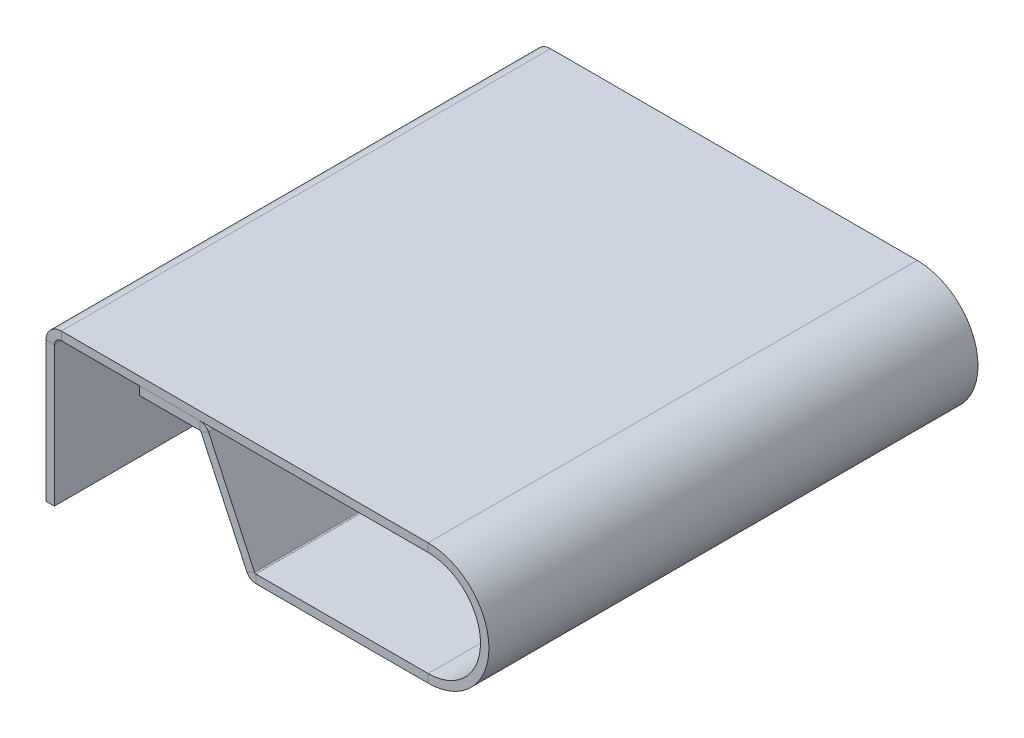
ISO-10303-21;
HEADER;
FILE_DESCRIPTION(('STEP AP214'),'2;1');
FILE_NAME('part.step','',(''),(''),'','','');
FILE_SCHEMA(('AUTOMOTIVE_DESIGN { 1 0 10303 214 1 1 1 1 }'));
ENDSEC;
DATA;
#1=APPLICATION_CONTEXT('core data for automotive mechanical design processes');
#2=APPLICATION_PROTOCOL_DEFINITION('international standard','automotive_design',2000,#1);
#3=PRODUCT_CONTEXT('',#1,'mechanical');
#4=PRODUCT('Part','Part','',(#3));
#5=PRODUCT_RELATED_PRODUCT_CATEGORY('part','',(#4));
#6=PRODUCT_DEFINITION_FORMATION('','',#4);
#7=PRODUCT_DEFINITION_CONTEXT('part definition',#1,'design');
#8=PRODUCT_DEFINITION('design','',#6,#7);
#9=PRODUCT_DEFINITION_SHAPE('','',#8);
#10=(LENGTH_UNIT() NAMED_UNIT(*) SI_UNIT(.MILLI.,.METRE.));
#11=(NAMED_UNIT(*) PLANE_ANGLE_UNIT() SI_UNIT($,.RADIAN.));
#12=(NAMED_UNIT(*) SI_UNIT($,.STERADIAN.) SOLID_ANGLE_UNIT());
#13=UNCERTAINTY_MEASURE_WITH_UNIT(LENGTH_MEASURE(1.E-05),#10,'distance_accuracy_value','');
#14=(GEOMETRIC_REPRESENTATION_CONTEXT(3) GLOBAL_UNCERTAINTY_ASSIGNED_CONTEXT((#13)) GLOBAL_UNIT_ASSIGNED_CONTEXT((#10,
#11,#12)) REPRESENTATION_CONTEXT('',''));
#15=CARTESIAN_POINT('',(0.,0.,0.));
#16=DIRECTION('',(0.,0.,1.));
#17=DIRECTION('',(1.,0.,0.));
#18=AXIS2_PLACEMENT_3D('',#15,#16,#17);
#19=CARTESIAN_POINT('',(15.9867258771282,-15.3,0.));
#20=DIRECTION('',(0.,-1.,0.));
#21=DIRECTION('',(0.,0.,-1.));
#22=AXIS2_PLACEMENT_3D('',#19,#20,#21);
#23=PLANE('',#22);
#24=DIRECTION('',(1.,0.,0.));
#25=VECTOR('',#24,1.);
#26=CARTESIAN_POINT('',(-21.5132741228718,-15.2999999999999,-35.));
#27=LINE('',#26,#25);
#28=CARTESIAN_POINT('',(1.00000000000001,-15.3,-35.));
#29=VERTEX_POINT('',#28);
#30=CARTESIAN_POINT('',(53.4867258771282,-15.3000000000002,-35.));
#31=VERTEX_POINT('',#30);
#32=EDGE_CURVE('E57',#29,#31,#27,.T.);
#33=ORIENTED_EDGE('',*,*,#32,.F.);
#34=DIRECTION('',(0.,0.,1.));
#35=VECTOR('',#34,1.);
#36=CARTESIAN_POINT('',(1.00000000000001,-15.3,0.));
#37=LINE('',#36,#35);
#38=CARTESIAN_POINT('',(1.00000000000001,-15.3,35.));
#39=VERTEX_POINT('',#38);
#40=EDGE_CURVE('E192',#29,#39,#37,.T.);
#41=ORIENTED_EDGE('',*,*,#40,.T.);
#42=DIRECTION('',(-1.,0.,0.));
#43=VECTOR('',#42,1.);
#44=CARTESIAN_POINT('',(-21.5132741228718,-15.2999999999999,35.));
#45=LINE('',#44,#43);
#46=CARTESIAN_POINT('',(53.4867258771282,-15.3000000000002,35.));
#47=VERTEX_POINT('',#46);
#48=EDGE_CURVE('E227',#47,#39,#45,.T.);
#49=ORIENTED_EDGE('',*,*,#48,.F.);
#50=DIRECTION('',(0.,0.,1.));
#51=VECTOR('',#50,1.);
#52=CARTESIAN_POINT('',(53.4867258771282,-15.3000000000002,35.));
#53=LINE('',#52,#51);
#54=EDGE_CURVE('E214',#31,#47,#53,.T.);
#55=ORIENTED_EDGE('',*,*,#54,.F.);
#56=EDGE_LOOP('',(#33,#41,#49,#55));
#57=FACE_BOUND('',#56,.T.);
#58=ADVANCED_FACE('F53',(#57),#23,.F.);
#59=CARTESIAN_POINT('',(30.7227864186979,-35.8428217189694,0.));
#60=DIRECTION('',(-0.906307787036652,-0.422618261740694,0.));
#61=DIRECTION('',(0.,0.,-1.));
#62=AXIS2_PLACEMENT_3D('',#59,#60,#61);
#63=PLANE('',#62);
#64=DIRECTION('',(0.422618261740694,-0.906307787036652,0.));
#65=VECTOR('',#64,1.);
#66=CARTESIAN_POINT('',(30.7227864186979,-35.8428217189694,-35.));
#67=LINE('',#66,#65);
#68=CARTESIAN_POINT('',(28.6438478878948,-31.3845236523482,-35.));
#69=VERTEX_POINT('',#68);
#70=CARTESIAN_POINT('',(22.0800130575366,-17.3083344335631,-35.));
#71=VERTEX_POINT('',#70);
#72=EDGE_CURVE('E77',#69,#71,#67,.F.);
#73=ORIENTED_EDGE('',*,*,#72,.T.);
#74=DIRECTION('',(0.,0.,1.));
#75=VECTOR('',#74,1.);
#76=CARTESIAN_POINT('',(22.0800130575366,-17.3083344335631,0.));
#77=LINE('',#76,#75);
#78=CARTESIAN_POINT('',(22.0800130575366,-17.3083344335631,35.));
#79=VERTEX_POINT('',#78);
#80=EDGE_CURVE('E296',#71,#79,#77,.T.);
#81=ORIENTED_EDGE('',*,*,#80,.T.);
#82=DIRECTION('',(0.422618261740694,-0.906307787036652,0.));
#83=VECTOR('',#82,1.);
#84=CARTESIAN_POINT('',(30.7227864186979,-35.8428217189695,35.));
#85=LINE('',#84,#83);
#86=CARTESIAN_POINT('',(28.6438478878948,-31.3845236523482,35.));
#87=VERTEX_POINT('',#86);
#88=EDGE_CURVE('E302',#79,#87,#85,.T.);
#89=ORIENTED_EDGE('',*,*,#88,.T.);
#90=DIRECTION('',(0.,0.,1.));
#91=VECTOR('',#90,1.);
#92=CARTESIAN_POINT('',(28.6438478878948,-31.3845236523482,0.));
#93=LINE('',#92,#91);
#94=EDGE_CURVE('E285',#69,#87,#93,.T.);
#95=ORIENTED_EDGE('',*,*,#94,.F.);
#96=EDGE_LOOP('',(#73,#81,#89,#95));
#97=FACE_BOUND('',#96,.T.);
#98=ADVANCED_FACE('F378',(#97),#63,.F.);
#99=CARTESIAN_POINT('',(29.6352170742539,-36.3499636330583,35.));
#100=DIRECTION('',(0.,0.,-1.));
#101=DIRECTION('',(0.422618261740694,-0.906307787036652,0.));
#102=AXIS2_PLACEMENT_3D('',#99,#100,#101);
#103=PLANE('',#102);
#104=DIRECTION('',(0.906307787036652,0.422618261740694,0.));
#105=VECTOR('',#104,1.);
#106=CARTESIAN_POINT('',(20.9924437130926,-17.8154763476519,35.));
#107=LINE('',#106,#105);
#108=CARTESIAN_POINT('',(20.9924437130926,-17.8154763476519,35.));
#109=VERTEX_POINT('',#108);
#110=EDGE_CURVE('E293',#109,#79,#107,.T.);
#111=ORIENTED_EDGE('',*,*,#110,.F.);
#112=DIRECTION('',(0.422618261740694,-0.906307787036652,0.));
#113=VECTOR('',#112,1.);
#114=CARTESIAN_POINT('',(29.6352170742539,-36.3499636330583,35.));
#115=LINE('',#114,#113);
#116=CARTESIAN_POINT('',(27.5562785434508,-31.8916655664371,35.));
#117=VERTEX_POINT('',#116);
#118=EDGE_CURVE('E282',#109,#117,#115,.T.);
#119=ORIENTED_EDGE('',*,*,#118,.T.);
#120=DIRECTION('',(0.906307787036652,0.422618261740694,0.));
#121=VECTOR('',#120,1.);
#122=CARTESIAN_POINT('',(27.5562785434508,-31.8916655664371,35.));
#123=LINE('',#122,#121);
#124=EDGE_CURVE('E287',#117,#87,#123,.T.);
#125=ORIENTED_EDGE('',*,*,#124,.T.);
#126=ORIENTED_EDGE('',*,*,#88,.F.);
#127=EDGE_LOOP('',(#111,#119,#125,#126));
#128=FACE_BOUND('',#127,.T.);
#129=ADVANCED_FACE('F309',(#128),#103,.F.);
#130=CARTESIAN_POINT('',(29.6352170742539,-36.3499636330583,-35.));
#131=DIRECTION('',(0.,0.,1.));
#132=DIRECTION('',(-0.422618261740694,0.906307787036652,0.));
#133=AXIS2_PLACEMENT_3D('',#130,#131,#132);
#134=PLANE('',#133);
#135=DIRECTION('',(-0.906307787036652,-0.422618261740694,0.));
#136=VECTOR('',#135,1.);
#137=CARTESIAN_POINT('',(20.9924437130926,-17.8154763476519,-35.));
#138=LINE('',#137,#136);
#139=CARTESIAN_POINT('',(20.9924437130926,-17.8154763476519,-35.));
#140=VERTEX_POINT('',#139);
#141=EDGE_CURVE('E202',#71,#140,#138,.T.);
#142=ORIENTED_EDGE('',*,*,#141,.F.);
#143=ORIENTED_EDGE('',*,*,#72,.F.);
#144=DIRECTION('',(-0.906307787036652,-0.422618261740694,0.));
#145=VECTOR('',#144,1.);
#146=CARTESIAN_POINT('',(27.5562785434508,-31.891665566437,-35.));
#147=LINE('',#146,#145);
#148=CARTESIAN_POINT('',(27.5562785434508,-31.8916655664371,-35.));
#149=VERTEX_POINT('',#148);
#150=EDGE_CURVE('E281',#69,#149,#147,.T.);
#151=ORIENTED_EDGE('',*,*,#150,.T.);
#152=DIRECTION('',(-0.422618261740694,0.906307787036652,0.));
#153=VECTOR('',#152,1.);
#154=CARTESIAN_POINT('',(29.6352170742539,-36.3499636330583,-35.));
#155=LINE('',#154,#153);
#156=EDGE_CURVE('E300',#149,#140,#155,.T.);
#157=ORIENTED_EDGE('',*,*,#156,.T.);
#158=EDGE_LOOP('',(#142,#143,#151,#157));
#159=FACE_BOUND('',#158,.T.);
#160=ADVANCED_FACE('F490',(#159),#134,.F.);
#161=CARTESIAN_POINT('',(29.6352170742539,-36.3499636330583,0.));
#162=DIRECTION('',(-0.906307787036652,-0.422618261740694,0.));
#163=DIRECTION('',(0.,0.,-1.));
#164=AXIS2_PLACEMENT_3D('',#161,#162,#163);
#165=PLANE('',#164);
#166=DIRECTION('',(0.,0.,1.));
#167=VECTOR('',#166,1.);
#168=CARTESIAN_POINT('',(20.9924437130926,-17.8154763476519,0.));
#169=LINE('',#168,#167);
#170=EDGE_CURVE('E290',#140,#109,#169,.T.);
#171=ORIENTED_EDGE('',*,*,#170,.F.);
#172=ORIENTED_EDGE('',*,*,#156,.F.);
#173=DIRECTION('',(0.,0.,1.));
#174=VECTOR('',#173,1.);
#175=CARTESIAN_POINT('',(27.5562785434508,-31.8916655664371,0.));
#176=LINE('',#175,#174);
#177=EDGE_CURVE('E278',#149,#117,#176,.T.);
#178=ORIENTED_EDGE('',*,*,#177,.T.);
#179=ORIENTED_EDGE('',*,*,#118,.F.);
#180=EDGE_LOOP('',(#171,#172,#178,#179));
#181=FACE_BOUND('',#180,.T.);
#182=ADVANCED_FACE('F314',(#181),#165,.T.);
#183=CARTESIAN_POINT('',(-21.5132741228718,-15.2999999999999,35.));
#184=DIRECTION('',(0.,0.,1.));
#185=DIRECTION('',(0.,-1.,0.));
#186=AXIS2_PLACEMENT_3D('',#183,#184,#185);
#187=PLANE('',#186);
#188=DIRECTION('',(0.,1.,0.));
#189=VECTOR('',#188,1.);
#190=CARTESIAN_POINT('',(1.00000000000001,-15.3,35.));
#191=LINE('',#190,#189);
#192=CARTESIAN_POINT('',(1.,-16.5,35.));
#193=VERTEX_POINT('',#192);
#194=EDGE_CURVE('E12',#193,#39,#191,.T.);
#195=ORIENTED_EDGE('',*,*,#194,.F.);
#196=DIRECTION('',(-1.,0.,0.));
#197=VECTOR('',#196,1.);
#198=CARTESIAN_POINT('',(-21.5132741228718,-16.4999999999999,35.));
#199=LINE('',#198,#197);
#200=CARTESIAN_POINT('',(53.4867258771282,-16.5000000000002,35.));
#201=VERTEX_POINT('',#200);
#202=EDGE_CURVE('E231',#201,#193,#199,.T.);
#203=ORIENTED_EDGE('',*,*,#202,.F.);
#204=DIRECTION('',(0.,-1.,0.));
#205=VECTOR('',#204,1.);
#206=CARTESIAN_POINT('',(53.4867258771282,-15.3000000000002,35.));
#207=LINE('',#206,#205);
#208=EDGE_CURVE('E256',#47,#201,#207,.T.);
#209=ORIENTED_EDGE('',*,*,#208,.F.);
#210=ORIENTED_EDGE('',*,*,#48,.T.);
#211=EDGE_LOOP('',(#195,#203,#209,#210));
#212=FACE_BOUND('',#211,.T.);
#213=ADVANCED_FACE('F55',(#212),#187,.T.);
#214=CARTESIAN_POINT('',(15.9867258771281,-16.5,0.));
#215=DIRECTION('',(0.,-1.,0.));
#216=DIRECTION('',(0.,0.,-1.));
#217=AXIS2_PLACEMENT_3D('',#214,#215,#216);
#218=PLANE('',#217);
#219=DIRECTION('',(0.,0.,1.));
#220=VECTOR('',#219,1.);
#221=CARTESIAN_POINT('',(1.,-16.5,0.));
#222=LINE('',#221,#220);
#223=CARTESIAN_POINT('',(1.,-16.5,-35.));
#224=VERTEX_POINT('',#223);
#225=EDGE_CURVE('E62',#224,#193,#222,.T.);
#226=ORIENTED_EDGE('',*,*,#225,.F.);
#227=DIRECTION('',(1.,0.,0.));
#228=VECTOR('',#227,1.);
#229=CARTESIAN_POINT('',(-21.5132741228718,-16.4999999999999,-35.));
#230=LINE('',#229,#228);
#231=CARTESIAN_POINT('',(53.4867258771282,-16.5000000000002,-35.));
#232=VERTEX_POINT('',#231);
#233=EDGE_CURVE('E219',#224,#232,#230,.T.);
#234=ORIENTED_EDGE('',*,*,#233,.T.);
#235=DIRECTION('',(0.,0.,1.));
#236=VECTOR('',#235,1.);
#237=CARTESIAN_POINT('',(53.4867258771282,-16.5000000000002,35.));
#238=LINE('',#237,#236);
#239=EDGE_CURVE('E229',#232,#201,#238,.T.);
#240=ORIENTED_EDGE('',*,*,#239,.T.);
#241=ORIENTED_EDGE('',*,*,#202,.T.);
#242=EDGE_LOOP('',(#226,#234,#240,#241));
#243=FACE_BOUND('',#242,.T.);
#244=ADVANCED_FACE('F234',(#243),#218,.T.);
#245=CARTESIAN_POINT('',(-21.5132741228718,-15.2999999999999,-35.));
#246=DIRECTION('',(0.,0.,-1.));
#247=DIRECTION('',(0.,1.,0.));
#248=AXIS2_PLACEMENT_3D('',#245,#246,#247);
#249=PLANE('',#248);
#250=DIRECTION('',(0.,-1.,0.));
#251=VECTOR('',#250,1.);
#252=CARTESIAN_POINT('',(1.00000000000001,-15.3,-35.));
#253=LINE('',#252,#251);
#254=EDGE_CURVE('E201',#29,#224,#253,.T.);
#255=ORIENTED_EDGE('',*,*,#254,.F.);
#256=ORIENTED_EDGE('',*,*,#32,.T.);
#257=DIRECTION('',(0.,-1.,0.));
#258=VECTOR('',#257,1.);
#259=CARTESIAN_POINT('',(53.4867258771282,-15.3000000000002,-35.));
#260=LINE('',#259,#258);
#261=EDGE_CURVE('E218',#31,#232,#260,.T.);
#262=ORIENTED_EDGE('',*,*,#261,.T.);
#263=ORIENTED_EDGE('',*,*,#233,.F.);
#264=EDGE_LOOP('',(#255,#256,#262,#263));
#265=FACE_BOUND('',#264,.T.);
#266=ADVANCED_FACE('F221',(#265),#249,.T.);
#267=CARTESIAN_POINT('',(53.4867258771281,-24.0000000000002,35.));
#268=DIRECTION('',(0.,0.,-1.));
#269=DIRECTION('',(0.,1.,0.));
#270=AXIS2_PLACEMENT_3D('',#267,#268,#269);
#271=PLANE('',#270);
#272=CARTESIAN_POINT('',(53.4867258771281,-24.0000000000002,35.));
#273=DIRECTION('',(0.,0.,1.));
#274=DIRECTION('',(0.,-1.,0.));
#275=AXIS2_PLACEMENT_3D('',#272,#273,#274);
#276=CIRCLE('',#275,7.5);
#277=CARTESIAN_POINT('',(53.4867258771281,-31.5000000000002,35.));
#278=VERTEX_POINT('',#277);
#279=EDGE_CURVE('E250',#278,#201,#276,.T.);
#280=ORIENTED_EDGE('',*,*,#279,.F.);
#281=DIRECTION('',(0.,-1.,0.));
#282=VECTOR('',#281,1.);
#283=CARTESIAN_POINT('',(53.4867258771281,-32.7000000000002,35.));
#284=LINE('',#283,#282);
#285=CARTESIAN_POINT('',(53.4867258771281,-32.7000000000002,35.));
#286=VERTEX_POINT('',#285);
#287=EDGE_CURVE('E241',#278,#286,#284,.T.);
#288=ORIENTED_EDGE('',*,*,#287,.T.);
#289=CARTESIAN_POINT('',(53.4867258771281,-24.0000000000002,35.));
#290=DIRECTION('',(0.,0.,1.));
#291=DIRECTION('',(0.,-1.,0.));
#292=AXIS2_PLACEMENT_3D('',#289,#290,#291);
#293=CIRCLE('',#292,8.7);
#294=EDGE_CURVE('E261',#286,#47,#293,.T.);
#295=ORIENTED_EDGE('',*,*,#294,.T.);
#296=ORIENTED_EDGE('',*,*,#208,.T.);
#297=EDGE_LOOP('',(#280,#288,#295,#296));
#298=FACE_BOUND('',#297,.T.);
#299=ADVANCED_FACE('F364',(#298),#271,.F.);
#300=CARTESIAN_POINT('',(53.4867258771281,-24.0000000000002,35.));
#301=DIRECTION('',(0.,0.,1.));
#302=DIRECTION('',(0.,-1.,0.));
#303=AXIS2_PLACEMENT_3D('',#300,#301,#302);
#304=CYLINDRICAL_SURFACE('',#303,7.5);
#305=ORIENTED_EDGE('',*,*,#239,.F.);
#306=CARTESIAN_POINT('',(53.4867258771281,-24.0000000000002,-35.));
#307=DIRECTION('',(0.,0.,1.));
#308=DIRECTION('',(0.,-1.,0.));
#309=AXIS2_PLACEMENT_3D('',#306,#307,#308);
#310=CIRCLE('',#309,7.5);
#311=CARTESIAN_POINT('',(53.4867258771281,-31.5000000000002,-35.));
#312=VERTEX_POINT('',#311);
#313=EDGE_CURVE('E248',#232,#312,#310,.F.);
#314=ORIENTED_EDGE('',*,*,#313,.T.);
#315=DIRECTION('',(0.,0.,-1.));
#316=VECTOR('',#315,1.);
#317=CARTESIAN_POINT('',(53.4867258771281,-31.5000000000002,0.));
#318=LINE('',#317,#316);
#319=EDGE_CURVE('E339',#278,#312,#318,.T.);
#320=ORIENTED_EDGE('',*,*,#319,.F.);
#321=ORIENTED_EDGE('',*,*,#279,.T.);
#322=EDGE_LOOP('',(#305,#314,#320,#321));
#323=FACE_BOUND('',#322,.T.);
#324=ADVANCED_FACE('F246',(#323),#304,.F.);
#325=CARTESIAN_POINT('',(53.4867258771281,-24.0000000000002,-35.));
#326=DIRECTION('',(0.,0.,-1.));
#327=DIRECTION('',(0.,1.,0.));
#328=AXIS2_PLACEMENT_3D('',#325,#326,#327);
#329=PLANE('',#328);
#330=DIRECTION('',(0.,-1.,0.));
#331=VECTOR('',#330,1.);
#332=CARTESIAN_POINT('',(53.4867258771281,-32.7000000000002,-35.));
#333=LINE('',#332,#331);
#334=CARTESIAN_POINT('',(53.4867258771281,-32.7000000000002,-35.));
#335=VERTEX_POINT('',#334);
#336=EDGE_CURVE('E255',#312,#335,#333,.T.);
#337=ORIENTED_EDGE('',*,*,#336,.F.);
#338=ORIENTED_EDGE('',*,*,#313,.F.);
#339=ORIENTED_EDGE('',*,*,#261,.F.);
#340=CARTESIAN_POINT('',(53.4867258771281,-24.0000000000002,-35.));
#341=DIRECTION('',(0.,0.,1.));
#342=DIRECTION('',(0.,-1.,0.));
#343=AXIS2_PLACEMENT_3D('',#340,#341,#342);
#344=CIRCLE('',#343,8.7);
#345=EDGE_CURVE('E258',#31,#335,#344,.F.);
#346=ORIENTED_EDGE('',*,*,#345,.T.);
#347=EDGE_LOOP('',(#337,#338,#339,#346));
#348=FACE_BOUND('',#347,.T.);
#349=ADVANCED_FACE('F253',(#348),#329,.T.);
#350=CARTESIAN_POINT('',(53.4867258771281,-24.0000000000002,35.));
#351=DIRECTION('',(0.,0.,1.));
#352=DIRECTION('',(0.,-1.,0.));
#353=AXIS2_PLACEMENT_3D('',#350,#351,#352);
#354=CYLINDRICAL_SURFACE('',#353,8.7);
#355=ORIENTED_EDGE('',*,*,#54,.T.);
#356=ORIENTED_EDGE('',*,*,#294,.F.);
#357=DIRECTION('',(0.,0.,-1.));
#358=VECTOR('',#357,1.);
#359=CARTESIAN_POINT('',(53.4867258771281,-32.7000000000002,0.));
#360=LINE('',#359,#358);
#361=EDGE_CURVE('E351',#286,#335,#360,.T.);
#362=ORIENTED_EDGE('',*,*,#361,.T.);
#363=ORIENTED_EDGE('',*,*,#345,.F.);
#364=EDGE_LOOP('',(#355,#356,#362,#363));
#365=FACE_BOUND('',#364,.T.);
#366=ADVANCED_FACE('F355',(#365),#354,.T.);
#367=CARTESIAN_POINT('',(32.8367258771281,-32.7000000000001,0.));
#368=DIRECTION('',(0.,-1.,0.));
#369=DIRECTION('',(0.,0.,-1.));
#370=AXIS2_PLACEMENT_3D('',#367,#368,#369);
#371=PLANE('',#370);
#372=DIRECTION('',(0.,0.,1.));
#373=VECTOR('',#372,1.);
#374=CARTESIAN_POINT('',(28.8251094453021,-32.7000000000001,0.));
#375=LINE('',#374,#373);
#376=CARTESIAN_POINT('',(28.8251094453021,-32.7000000000001,-35.));
#377=VERTEX_POINT('',#376);
#378=CARTESIAN_POINT('',(28.8251094453021,-32.7000000000001,35.));
#379=VERTEX_POINT('',#378);
#380=EDGE_CURVE('E274',#377,#379,#375,.T.);
#381=ORIENTED_EDGE('',*,*,#380,.F.);
#382=DIRECTION('',(-1.,0.,0.));
#383=VECTOR('',#382,1.);
#384=CARTESIAN_POINT('',(32.8367258771281,-32.7000000000001,-35.));
#385=LINE('',#384,#383);
#386=EDGE_CURVE('E348',#335,#377,#385,.T.);
#387=ORIENTED_EDGE('',*,*,#386,.F.);
#388=ORIENTED_EDGE('',*,*,#361,.F.);
#389=DIRECTION('',(1.,0.,0.));
#390=VECTOR('',#389,1.);
#391=CARTESIAN_POINT('',(32.8367258771281,-32.7000000000001,35.));
#392=LINE('',#391,#390);
#393=EDGE_CURVE('E305',#379,#286,#392,.T.);
#394=ORIENTED_EDGE('',*,*,#393,.F.);
#395=EDGE_LOOP('',(#381,#387,#388,#394));
#396=FACE_BOUND('',#395,.T.);
#397=ADVANCED_FACE('F360',(#396),#371,.T.);
#398=CARTESIAN_POINT('',(32.8367258771281,-32.7000000000001,-35.));
#399=DIRECTION('',(0.,0.,1.));
#400=DIRECTION('',(-1.,0.,0.));
#401=AXIS2_PLACEMENT_3D('',#398,#399,#400);
#402=PLANE('',#401);
#403=DIRECTION('',(0.,-1.,0.));
#404=VECTOR('',#403,1.);
#405=CARTESIAN_POINT('',(28.8251094453021,-32.7000000000001,-35.));
#406=LINE('',#405,#404);
#407=CARTESIAN_POINT('',(28.8251094453021,-31.5000000000001,-35.));
#408=VERTEX_POINT('',#407);
#409=EDGE_CURVE('E230',#408,#377,#406,.T.);
#410=ORIENTED_EDGE('',*,*,#409,.F.);
#411=DIRECTION('',(1.,0.,0.));
#412=VECTOR('',#411,1.);
#413=CARTESIAN_POINT('',(32.8367258771281,-31.5000000000001,-35.));
#414=LINE('',#413,#412);
#415=EDGE_CURVE('E346',#312,#408,#414,.F.);
#416=ORIENTED_EDGE('',*,*,#415,.F.);
#417=ORIENTED_EDGE('',*,*,#336,.T.);
#418=ORIENTED_EDGE('',*,*,#386,.T.);
#419=EDGE_LOOP('',(#410,#416,#417,#418));
#420=FACE_BOUND('',#419,.T.);
#421=ADVANCED_FACE('F371',(#420),#402,.F.);
#422=CARTESIAN_POINT('',(32.8367258771281,-31.5000000000001,0.));
#423=DIRECTION('',(0.,-1.,0.));
#424=DIRECTION('',(0.,0.,-1.));
#425=AXIS2_PLACEMENT_3D('',#422,#423,#424);
#426=PLANE('',#425);
#427=ORIENTED_EDGE('',*,*,#415,.T.);
#428=DIRECTION('',(0.,0.,1.));
#429=VECTOR('',#428,1.);
#430=CARTESIAN_POINT('',(28.8251094453021,-31.5000000000001,0.));
#431=LINE('',#430,#429);
#432=CARTESIAN_POINT('',(28.8251094453022,-31.5000000000001,35.));
#433=VERTEX_POINT('',#432);
#434=EDGE_CURVE('E343',#408,#433,#431,.T.);
#435=ORIENTED_EDGE('',*,*,#434,.T.);
#436=DIRECTION('',(1.,0.,0.));
#437=VECTOR('',#436,1.);
#438=CARTESIAN_POINT('',(32.8367258771281,-31.5000000000001,35.));
#439=LINE('',#438,#437);
#440=EDGE_CURVE('E341',#433,#278,#439,.T.);
#441=ORIENTED_EDGE('',*,*,#440,.T.);
#442=ORIENTED_EDGE('',*,*,#319,.T.);
#443=EDGE_LOOP('',(#427,#435,#441,#442));
#444=FACE_BOUND('',#443,.T.);
#445=ADVANCED_FACE('F369',(#444),#426,.F.);
#446=CARTESIAN_POINT('',(32.8367258771281,-32.7000000000001,35.));
#447=DIRECTION('',(0.,0.,-1.));
#448=DIRECTION('',(1.,0.,0.));
#449=AXIS2_PLACEMENT_3D('',#446,#447,#448);
#450=PLANE('',#449);
#451=DIRECTION('',(0.,1.,0.));
#452=VECTOR('',#451,1.);
#453=CARTESIAN_POINT('',(28.8251094453021,-32.7000000000001,35.));
#454=LINE('',#453,#452);
#455=EDGE_CURVE('E271',#379,#433,#454,.T.);
#456=ORIENTED_EDGE('',*,*,#455,.F.);
#457=ORIENTED_EDGE('',*,*,#393,.T.);
#458=ORIENTED_EDGE('',*,*,#287,.F.);
#459=ORIENTED_EDGE('',*,*,#440,.F.);
#460=EDGE_LOOP('',(#456,#457,#458,#459));
#461=FACE_BOUND('',#460,.T.);
#462=ADVANCED_FACE('F366',(#461),#450,.F.);
#463=CARTESIAN_POINT('',(28.8251094453022,-31.3000000000001,-35.));
#464=DIRECTION('',(0.,0.,-1.));
#465=DIRECTION('',(0.,1.,0.));
#466=AXIS2_PLACEMENT_3D('',#463,#464,#465);
#467=PLANE('',#466);
#468=ORIENTED_EDGE('',*,*,#150,.F.);
#469=CARTESIAN_POINT('',(28.8251094453022,-31.3000000000001,-35.));
#470=DIRECTION('',(0.,0.,-1.));
#471=DIRECTION('',(1.,0.,0.));
#472=AXIS2_PLACEMENT_3D('',#469,#470,#471);
#473=CIRCLE('',#472,0.2);
#474=EDGE_CURVE('E330',#69,#408,#473,.F.);
#475=ORIENTED_EDGE('',*,*,#474,.T.);
#476=ORIENTED_EDGE('',*,*,#409,.T.);
#477=CARTESIAN_POINT('',(28.8251094453022,-31.3000000000001,-35.));
#478=DIRECTION('',(0.,0.,1.));
#479=DIRECTION('',(0.,1.,0.));
#480=AXIS2_PLACEMENT_3D('',#477,#478,#479);
#481=CIRCLE('',#480,1.4);
#482=EDGE_CURVE('E319',#149,#377,#481,.T.);
#483=ORIENTED_EDGE('',*,*,#482,.F.);
#484=EDGE_LOOP('',(#468,#475,#476,#483));
#485=FACE_BOUND('',#484,.T.);
#486=ADVANCED_FACE('F322',(#485),#467,.T.);
#487=CARTESIAN_POINT('',(28.8251094453021,-31.3000000000001,35.));
#488=DIRECTION('',(0.,0.,1.));
#489=DIRECTION('',(0.,-1.,0.));
#490=AXIS2_PLACEMENT_3D('',#487,#488,#489);
#491=PLANE('',#490);
#492=CARTESIAN_POINT('',(28.8251094453021,-31.3000000000001,35.));
#493=DIRECTION('',(0.,0.,-1.));
#494=DIRECTION('',(1.,0.,0.));
#495=AXIS2_PLACEMENT_3D('',#492,#493,#494);
#496=CIRCLE('',#495,0.2);
#497=EDGE_CURVE('E326',#433,#87,#496,.T.);
#498=ORIENTED_EDGE('',*,*,#497,.T.);
#499=ORIENTED_EDGE('',*,*,#124,.F.);
#500=CARTESIAN_POINT('',(28.8251094453021,-31.3000000000001,35.));
#501=DIRECTION('',(0.,0.,-1.));
#502=DIRECTION('',(0.,-1.,0.));
#503=AXIS2_PLACEMENT_3D('',#500,#501,#502);
#504=CIRCLE('',#503,1.4);
#505=EDGE_CURVE('E277',#379,#117,#504,.T.);
#506=ORIENTED_EDGE('',*,*,#505,.F.);
#507=ORIENTED_EDGE('',*,*,#455,.T.);
#508=EDGE_LOOP('',(#498,#499,#506,#507));
#509=FACE_BOUND('',#508,.T.);
#510=ADVANCED_FACE('F377',(#509),#491,.T.);
#511=CARTESIAN_POINT('',(28.8251094453021,-31.3000000000001,70.0161673151502));
#512=DIRECTION('',(0.,0.,-1.));
#513=DIRECTION('',(1.,0.,0.));
#514=AXIS2_PLACEMENT_3D('',#511,#512,#513);
#515=CYLINDRICAL_SURFACE('',#514,1.4);
#516=ORIENTED_EDGE('',*,*,#380,.T.);
#517=ORIENTED_EDGE('',*,*,#505,.T.);
#518=ORIENTED_EDGE('',*,*,#177,.F.);
#519=ORIENTED_EDGE('',*,*,#482,.T.);
#520=EDGE_LOOP('',(#516,#517,#518,#519));
#521=FACE_BOUND('',#520,.T.);
#522=ADVANCED_FACE('F318',(#521),#515,.T.);
#523=CARTESIAN_POINT('',(28.8251094453021,-31.3000000000001,70.0161673151502));
#524=DIRECTION('',(0.,0.,-1.));
#525=DIRECTION('',(1.,0.,0.));
#526=AXIS2_PLACEMENT_3D('',#523,#524,#525);
#527=CYLINDRICAL_SURFACE('',#526,0.2);
#528=ORIENTED_EDGE('',*,*,#434,.F.);
#529=ORIENTED_EDGE('',*,*,#474,.F.);
#530=ORIENTED_EDGE('',*,*,#94,.T.);
#531=ORIENTED_EDGE('',*,*,#497,.F.);
#532=EDGE_LOOP('',(#528,#529,#530,#531));
#533=FACE_BOUND('',#532,.T.);
#534=ADVANCED_FACE('F375',(#533),#527,.F.);
#535=CARTESIAN_POINT('',(20.8111821556853,-17.9,-35.));
#536=DIRECTION('',(0.,0.,1.));
#537=DIRECTION('',(0.,-1.,0.));
#538=AXIS2_PLACEMENT_3D('',#535,#536,#537);
#539=PLANE('',#538);
#540=DIRECTION('',(0.,-1.,0.));
#541=VECTOR('',#540,1.);
#542=CARTESIAN_POINT('',(20.8111821556853,-17.7,-35.));
#543=LINE('',#542,#541);
#544=CARTESIAN_POINT('',(20.8111821556853,-16.5000000000001,-35.));
#545=VERTEX_POINT('',#544);
#546=CARTESIAN_POINT('',(20.8111821556853,-17.7,-35.));
#547=VERTEX_POINT('',#546);
#548=EDGE_CURVE('E401',#545,#547,#543,.T.);
#549=ORIENTED_EDGE('',*,*,#548,.F.);
#550=CARTESIAN_POINT('',(20.8111821556853,-17.9,-35.));
#551=DIRECTION('',(0.,0.,-1.));
#552=DIRECTION('',(1.,0.,0.));
#553=AXIS2_PLACEMENT_3D('',#550,#551,#552);
#554=CIRCLE('',#553,1.4);
#555=EDGE_CURVE('E395',#545,#71,#554,.T.);
#556=ORIENTED_EDGE('',*,*,#555,.T.);
#557=ORIENTED_EDGE('',*,*,#141,.T.);
#558=CARTESIAN_POINT('',(20.8111821556853,-17.9,-35.));
#559=DIRECTION('',(0.,0.,-1.));
#560=DIRECTION('',(0.,-1.,0.));
#561=AXIS2_PLACEMENT_3D('',#558,#559,#560);
#562=CIRCLE('',#561,0.2);
#563=EDGE_CURVE('E394',#547,#140,#562,.T.);
#564=ORIENTED_EDGE('',*,*,#563,.F.);
#565=EDGE_LOOP('',(#549,#556,#557,#564));
#566=FACE_BOUND('',#565,.T.);
#567=ADVANCED_FACE('F532',(#566),#539,.F.);
#568=CARTESIAN_POINT('',(20.8111821556853,-17.9000000000001,35.));
#569=DIRECTION('',(0.,0.,-1.));
#570=DIRECTION('',(0.,1.,0.));
#571=AXIS2_PLACEMENT_3D('',#568,#569,#570);
#572=PLANE('',#571);
#573=CARTESIAN_POINT('',(20.8111821556853,-17.9000000000001,35.));
#574=DIRECTION('',(0.,0.,-1.));
#575=DIRECTION('',(1.,0.,0.));
#576=AXIS2_PLACEMENT_3D('',#573,#574,#575);
#577=CIRCLE('',#576,1.4);
#578=CARTESIAN_POINT('',(20.8111821556853,-16.5000000000001,35.));
#579=VERTEX_POINT('',#578);
#580=EDGE_CURVE('E333',#79,#579,#577,.F.);
#581=ORIENTED_EDGE('',*,*,#580,.T.);
#582=DIRECTION('',(0.,1.,0.));
#583=VECTOR('',#582,1.);
#584=CARTESIAN_POINT('',(20.8111821556853,-17.7000000000001,35.));
#585=LINE('',#584,#583);
#586=CARTESIAN_POINT('',(20.8111821556853,-17.7000000000001,35.));
#587=VERTEX_POINT('',#586);
#588=EDGE_CURVE('E418',#587,#579,#585,.T.);
#589=ORIENTED_EDGE('',*,*,#588,.F.);
#590=CARTESIAN_POINT('',(20.8111821556853,-17.9000000000001,35.));
#591=DIRECTION('',(0.,0.,1.));
#592=DIRECTION('',(0.,1.,0.));
#593=AXIS2_PLACEMENT_3D('',#590,#591,#592);
#594=CIRCLE('',#593,0.2);
#595=EDGE_CURVE('E336',#109,#587,#594,.T.);
#596=ORIENTED_EDGE('',*,*,#595,.F.);
#597=ORIENTED_EDGE('',*,*,#110,.T.);
#598=EDGE_LOOP('',(#581,#589,#596,#597));
#599=FACE_BOUND('',#598,.T.);
#600=ADVANCED_FACE('F387',(#599),#572,.F.);
#601=CARTESIAN_POINT('',(20.8111821556853,-17.9000000000001,70.0280819473315));
#602=DIRECTION('',(0.,0.,-1.));
#603=DIRECTION('',(1.,0.,0.));
#604=AXIS2_PLACEMENT_3D('',#601,#602,#603);
#605=CYLINDRICAL_SURFACE('',#604,0.2);
#606=ORIENTED_EDGE('',*,*,#170,.T.);
#607=ORIENTED_EDGE('',*,*,#595,.T.);
#608=DIRECTION('',(0.,0.,1.));
#609=VECTOR('',#608,1.);
#610=CARTESIAN_POINT('',(20.8111821556853,-17.7000000000001,0.));
#611=LINE('',#610,#609);
#612=EDGE_CURVE('E413',#547,#587,#611,.T.);
#613=ORIENTED_EDGE('',*,*,#612,.F.);
#614=ORIENTED_EDGE('',*,*,#563,.T.);
#615=EDGE_LOOP('',(#606,#607,#613,#614));
#616=FACE_BOUND('',#615,.T.);
#617=ADVANCED_FACE('F535',(#616),#605,.F.);
#618=CARTESIAN_POINT('',(20.8111821556853,-17.9000000000001,70.0280819473315));
#619=DIRECTION('',(0.,0.,-1.));
#620=DIRECTION('',(1.,0.,0.));
#621=AXIS2_PLACEMENT_3D('',#618,#619,#620);
#622=CYLINDRICAL_SURFACE('',#621,1.4);
#623=ORIENTED_EDGE('',*,*,#80,.F.);
#624=ORIENTED_EDGE('',*,*,#555,.F.);
#625=DIRECTION('',(0.,0.,1.));
#626=VECTOR('',#625,1.);
#627=CARTESIAN_POINT('',(20.8111821556853,-16.5000000000001,0.));
#628=LINE('',#627,#626);
#629=EDGE_CURVE('E393',#545,#579,#628,.T.);
#630=ORIENTED_EDGE('',*,*,#629,.T.);
#631=ORIENTED_EDGE('',*,*,#580,.F.);
#632=EDGE_LOOP('',(#623,#624,#630,#631));
#633=FACE_BOUND('',#632,.T.);
#634=ADVANCED_FACE('F391',(#633),#622,.T.);
#635=CARTESIAN_POINT('',(12.1867258771282,-17.7,0.));
#636=DIRECTION('',(1.,0.,0.));
#637=DIRECTION('',(0.,0.,1.));
#638=AXIS2_PLACEMENT_3D('',#635,#636,#637);
#639=PLANE('',#638);
#640=DIRECTION('',(0.,-1.,0.));
#641=VECTOR('',#640,1.);
#642=CARTESIAN_POINT('',(12.1867258771282,-17.7,35.));
#643=LINE('',#642,#641);
#644=CARTESIAN_POINT('',(12.1867258771282,-16.5,35.));
#645=VERTEX_POINT('',#644);
#646=CARTESIAN_POINT('',(12.1867258771282,-17.7,35.));
#647=VERTEX_POINT('',#646);
#648=EDGE_CURVE('E421',#645,#647,#643,.T.);
#649=ORIENTED_EDGE('',*,*,#648,.F.);
#650=DIRECTION('',(0.,0.,-1.));
#651=VECTOR('',#650,1.);
#652=CARTESIAN_POINT('',(12.1867258771282,-16.5,0.));
#653=LINE('',#652,#651);
#654=CARTESIAN_POINT('',(12.1867258771282,-16.5,-35.));
#655=VERTEX_POINT('',#654);
#656=EDGE_CURVE('E426',#655,#645,#653,.F.);
#657=ORIENTED_EDGE('',*,*,#656,.F.);
#658=DIRECTION('',(0.,-1.,0.));
#659=VECTOR('',#658,1.);
#660=CARTESIAN_POINT('',(12.1867258771282,-17.7,-35.));
#661=LINE('',#660,#659);
#662=CARTESIAN_POINT('',(12.1867258771282,-17.7,-35.));
#663=VERTEX_POINT('',#662);
#664=EDGE_CURVE('E406',#655,#663,#661,.T.);
#665=ORIENTED_EDGE('',*,*,#664,.T.);
#666=DIRECTION('',(0.,0.,1.));
#667=VECTOR('',#666,1.);
#668=CARTESIAN_POINT('',(12.1867258771282,-17.7,0.));
#669=LINE('',#668,#667);
#670=EDGE_CURVE('E410',#663,#647,#669,.T.);
#671=ORIENTED_EDGE('',*,*,#670,.T.);
#672=EDGE_LOOP('',(#649,#657,#665,#671));
#673=FACE_BOUND('',#672,.T.);
#674=ADVANCED_FACE('F545',(#673),#639,.F.);
#675=CARTESIAN_POINT('',(42.1692973767307,-17.7000000000001,0.));
#676=DIRECTION('',(0.,-1.,0.));
#677=DIRECTION('',(0.,0.,-1.));
#678=AXIS2_PLACEMENT_3D('',#675,#676,#677);
#679=PLANE('',#678);
#680=DIRECTION('',(-1.,0.,0.));
#681=VECTOR('',#680,1.);
#682=CARTESIAN_POINT('',(42.1692973767307,-17.7000000000001,-35.));
#683=LINE('',#682,#681);
#684=EDGE_CURVE('E398',#547,#663,#683,.T.);
#685=ORIENTED_EDGE('',*,*,#684,.F.);
#686=ORIENTED_EDGE('',*,*,#612,.T.);
#687=DIRECTION('',(1.,0.,0.));
#688=VECTOR('',#687,1.);
#689=CARTESIAN_POINT('',(42.1692973767307,-17.7000000000001,35.));
#690=LINE('',#689,#688);
#691=EDGE_CURVE('E415',#647,#587,#690,.T.);
#692=ORIENTED_EDGE('',*,*,#691,.F.);
#693=ORIENTED_EDGE('',*,*,#670,.F.);
#694=EDGE_LOOP('',(#685,#686,#692,#693));
#695=FACE_BOUND('',#694,.T.);
#696=ADVANCED_FACE('F538',(#695),#679,.T.);
#697=CARTESIAN_POINT('',(42.1692973767307,-17.7000000000001,35.));
#698=DIRECTION('',(0.,0.,-1.));
#699=DIRECTION('',(1.,0.,0.));
#700=AXIS2_PLACEMENT_3D('',#697,#698,#699);
#701=PLANE('',#700);
#702=ORIENTED_EDGE('',*,*,#691,.T.);
#703=ORIENTED_EDGE('',*,*,#588,.T.);
#704=DIRECTION('',(1.,0.,0.));
#705=VECTOR('',#704,1.);
#706=CARTESIAN_POINT('',(42.1692973767307,-16.5000000000001,35.));
#707=LINE('',#706,#705);
#708=EDGE_CURVE('E429',#645,#579,#707,.T.);
#709=ORIENTED_EDGE('',*,*,#708,.F.);
#710=ORIENTED_EDGE('',*,*,#648,.T.);
#711=EDGE_LOOP('',(#702,#703,#709,#710));
#712=FACE_BOUND('',#711,.T.);
#713=ADVANCED_FACE('F541',(#712),#701,.F.);
#714=CARTESIAN_POINT('',(42.1692973767307,-16.5000000000001,0.));
#715=DIRECTION('',(0.,-1.,0.));
#716=DIRECTION('',(0.,0.,-1.));
#717=AXIS2_PLACEMENT_3D('',#714,#715,#716);
#718=PLANE('',#717);
#719=ORIENTED_EDGE('',*,*,#629,.F.);
#720=DIRECTION('',(1.,0.,0.));
#721=VECTOR('',#720,1.);
#722=CARTESIAN_POINT('',(42.1692973767307,-16.5000000000001,-35.));
#723=LINE('',#722,#721);
#724=EDGE_CURVE('E424',#545,#655,#723,.F.);
#725=ORIENTED_EDGE('',*,*,#724,.T.);
#726=ORIENTED_EDGE('',*,*,#656,.T.);
#727=ORIENTED_EDGE('',*,*,#708,.T.);
#728=EDGE_LOOP('',(#719,#725,#726,#727));
#729=FACE_BOUND('',#728,.T.);
#730=ADVANCED_FACE('F550',(#729),#718,.F.);
#731=CARTESIAN_POINT('',(42.1692973767307,-17.7000000000001,-35.));
#732=DIRECTION('',(0.,0.,1.));
#733=DIRECTION('',(-1.,0.,0.));
#734=AXIS2_PLACEMENT_3D('',#731,#732,#733);
#735=PLANE('',#734);
#736=ORIENTED_EDGE('',*,*,#724,.F.);
#737=ORIENTED_EDGE('',*,*,#548,.T.);
#738=ORIENTED_EDGE('',*,*,#684,.T.);
#739=ORIENTED_EDGE('',*,*,#664,.F.);
#740=EDGE_LOOP('',(#736,#737,#738,#739));
#741=FACE_BOUND('',#740,.T.);
#742=ADVANCED_FACE('F548',(#741),#735,.F.);
#743=CARTESIAN_POINT('',(-1.2,-37.5,35.));
#744=DIRECTION('',(0.,-1.,0.));
#745=DIRECTION('',(0.,0.,-1.));
#746=AXIS2_PLACEMENT_3D('',#743,#744,#745);
#747=PLANE('',#746);
#748=DIRECTION('',(0.,0.,-1.));
#749=VECTOR('',#748,1.);
#750=CARTESIAN_POINT('',(0.,-37.5,35.));
#751=LINE('',#750,#749);
#752=CARTESIAN_POINT('',(0.,-37.5,35.));
#753=VERTEX_POINT('',#752);
#754=CARTESIAN_POINT('',(0.,-37.5,-35.));
#755=VERTEX_POINT('',#754);
#756=EDGE_CURVE('E451',#753,#755,#751,.T.);
#757=ORIENTED_EDGE('',*,*,#756,.F.);
#758=DIRECTION('',(1.,0.,0.));
#759=VECTOR('',#758,1.);
#760=CARTESIAN_POINT('',(-1.2,-37.5,35.));
#761=LINE('',#760,#759);
#762=CARTESIAN_POINT('',(-1.2,-37.5,35.));
#763=VERTEX_POINT('',#762);
#764=EDGE_CURVE('E407',#763,#753,#761,.T.);
#765=ORIENTED_EDGE('',*,*,#764,.F.);
#766=DIRECTION('',(0.,0.,-1.));
#767=VECTOR('',#766,1.);
#768=CARTESIAN_POINT('',(-1.2,-37.5,35.));
#769=LINE('',#768,#767);
#770=CARTESIAN_POINT('',(-1.2,-37.5,-35.));
#771=VERTEX_POINT('',#770);
#772=EDGE_CURVE('E434',#763,#771,#769,.T.);
#773=ORIENTED_EDGE('',*,*,#772,.T.);
#774=DIRECTION('',(1.,0.,0.));
#775=VECTOR('',#774,1.);
#776=CARTESIAN_POINT('',(-1.2,-37.5,-35.));
#777=LINE('',#776,#775);
#778=EDGE_CURVE('E437',#771,#755,#777,.T.);
#779=ORIENTED_EDGE('',*,*,#778,.T.);
#780=EDGE_LOOP('',(#757,#765,#773,#779));
#781=FACE_BOUND('',#780,.T.);
#782=ADVANCED_FACE('F557',(#781),#747,.T.);
#783=CARTESIAN_POINT('',(-1.2,0.,0.));
#784=DIRECTION('',(1.,0.,0.));
#785=DIRECTION('',(0.,0.,-1.));
#786=AXIS2_PLACEMENT_3D('',#783,#784,#785);
#787=PLANE('',#786);
#788=DIRECTION('',(0.,0.,1.));
#789=VECTOR('',#788,1.);
#790=CARTESIAN_POINT('',(-1.2,-17.5,0.));
#791=LINE('',#790,#789);
#792=CARTESIAN_POINT('',(-1.2,-17.5,-35.));
#793=VERTEX_POINT('',#792);
#794=CARTESIAN_POINT('',(-1.2,-17.5,35.));
#795=VERTEX_POINT('',#794);
#796=EDGE_CURVE('E432',#793,#795,#791,.T.);
#797=ORIENTED_EDGE('',*,*,#796,.F.);
#798=DIRECTION('',(0.,1.,0.));
#799=VECTOR('',#798,1.);
#800=CARTESIAN_POINT('',(-1.2,-37.5,-35.));
#801=LINE('',#800,#799);
#802=EDGE_CURVE('E439',#771,#793,#801,.T.);
#803=ORIENTED_EDGE('',*,*,#802,.F.);
#804=ORIENTED_EDGE('',*,*,#772,.F.);
#805=DIRECTION('',(0.,-1.,0.));
#806=VECTOR('',#805,1.);
#807=CARTESIAN_POINT('',(-1.2,-37.5,35.));
#808=LINE('',#807,#806);
#809=EDGE_CURVE('E457',#795,#763,#808,.T.);
#810=ORIENTED_EDGE('',*,*,#809,.F.);
#811=EDGE_LOOP('',(#797,#803,#804,#810));
#812=FACE_BOUND('',#811,.T.);
#813=ADVANCED_FACE('F479',(#812),#787,.F.);
#814=CARTESIAN_POINT('',(-1.2,-37.5,-35.));
#815=DIRECTION('',(0.,0.,-1.));
#816=DIRECTION('',(-1.,0.,0.));
#817=AXIS2_PLACEMENT_3D('',#814,#815,#816);
#818=PLANE('',#817);
#819=ORIENTED_EDGE('',*,*,#802,.T.);
#820=DIRECTION('',(1.,0.,0.));
#821=VECTOR('',#820,1.);
#822=CARTESIAN_POINT('',(-1.2,-17.5,-35.));
#823=LINE('',#822,#821);
#824=CARTESIAN_POINT('',(0.,-17.5,-35.));
#825=VERTEX_POINT('',#824);
#826=EDGE_CURVE('E209',#793,#825,#823,.T.);
#827=ORIENTED_EDGE('',*,*,#826,.T.);
#828=DIRECTION('',(0.,1.,0.));
#829=VECTOR('',#828,1.);
#830=CARTESIAN_POINT('',(0.,-37.5,-35.));
#831=LINE('',#830,#829);
#832=EDGE_CURVE('E443',#755,#825,#831,.T.);
#833=ORIENTED_EDGE('',*,*,#832,.F.);
#834=ORIENTED_EDGE('',*,*,#778,.F.);
#835=EDGE_LOOP('',(#819,#827,#833,#834));
#836=FACE_BOUND('',#835,.T.);
#837=ADVANCED_FACE('F475',(#836),#818,.T.);
#838=CARTESIAN_POINT('',(0.,0.,0.));
#839=DIRECTION('',(1.,0.,0.));
#840=DIRECTION('',(0.,0.,-1.));
#841=AXIS2_PLACEMENT_3D('',#838,#839,#840);
#842=PLANE('',#841);
#843=ORIENTED_EDGE('',*,*,#832,.T.);
#844=DIRECTION('',(0.,0.,1.));
#845=VECTOR('',#844,1.);
#846=CARTESIAN_POINT('',(0.,-17.5,0.));
#847=LINE('',#846,#845);
#848=CARTESIAN_POINT('',(0.,-17.5,35.));
#849=VERTEX_POINT('',#848);
#850=EDGE_CURVE('E446',#825,#849,#847,.T.);
#851=ORIENTED_EDGE('',*,*,#850,.T.);
#852=DIRECTION('',(0.,-1.,0.));
#853=VECTOR('',#852,1.);
#854=CARTESIAN_POINT('',(0.,-37.5,35.));
#855=LINE('',#854,#853);
#856=EDGE_CURVE('E449',#849,#753,#855,.T.);
#857=ORIENTED_EDGE('',*,*,#856,.T.);
#858=ORIENTED_EDGE('',*,*,#756,.T.);
#859=EDGE_LOOP('',(#843,#851,#857,#858));
#860=FACE_BOUND('',#859,.T.);
#861=ADVANCED_FACE('F472',(#860),#842,.T.);
#862=CARTESIAN_POINT('',(-1.2,-37.5,35.));
#863=DIRECTION('',(0.,0.,1.));
#864=DIRECTION('',(1.,0.,0.));
#865=AXIS2_PLACEMENT_3D('',#862,#863,#864);
#866=PLANE('',#865);
#867=ORIENTED_EDGE('',*,*,#856,.F.);
#868=DIRECTION('',(-1.,0.,0.));
#869=VECTOR('',#868,1.);
#870=CARTESIAN_POINT('',(-1.2,-17.5,35.));
#871=LINE('',#870,#869);
#872=EDGE_CURVE('E454',#849,#795,#871,.T.);
#873=ORIENTED_EDGE('',*,*,#872,.T.);
#874=ORIENTED_EDGE('',*,*,#809,.T.);
#875=ORIENTED_EDGE('',*,*,#764,.T.);
#876=EDGE_LOOP('',(#867,#873,#874,#875));
#877=FACE_BOUND('',#876,.T.);
#878=ADVANCED_FACE('F683',(#877),#866,.T.);
#879=CARTESIAN_POINT('',(1.,-17.5,-35.));
#880=DIRECTION('',(0.,0.,-1.));
#881=DIRECTION('',(-1.,0.,0.));
#882=AXIS2_PLACEMENT_3D('',#879,#880,#881);
#883=PLANE('',#882);
#884=ORIENTED_EDGE('',*,*,#254,.T.);
#885=CARTESIAN_POINT('',(1.,-17.5,-35.));
#886=DIRECTION('',(0.,0.,-1.));
#887=DIRECTION('',(0.,1.,0.));
#888=AXIS2_PLACEMENT_3D('',#885,#886,#887);
#889=CIRCLE('',#888,1.);
#890=EDGE_CURVE('E463',#224,#825,#889,.F.);
#891=ORIENTED_EDGE('',*,*,#890,.T.);
#892=ORIENTED_EDGE('',*,*,#826,.F.);
#893=CARTESIAN_POINT('',(1.,-17.5,-35.));
#894=DIRECTION('',(0.,0.,1.));
#895=DIRECTION('',(-1.,0.,0.));
#896=AXIS2_PLACEMENT_3D('',#893,#894,#895);
#897=CIRCLE('',#896,2.2);
#898=EDGE_CURVE('E195',#29,#793,#897,.T.);
#899=ORIENTED_EDGE('',*,*,#898,.F.);
#900=EDGE_LOOP('',(#884,#891,#892,#899));
#901=FACE_BOUND('',#900,.T.);
#902=ADVANCED_FACE('F205',(#901),#883,.T.);
#903=CARTESIAN_POINT('',(1.,-17.5,35.));
#904=DIRECTION('',(0.,0.,1.));
#905=DIRECTION('',(1.,0.,0.));
#906=AXIS2_PLACEMENT_3D('',#903,#904,#905);
#907=PLANE('',#906);
#908=CARTESIAN_POINT('',(1.,-17.5,35.));
#909=DIRECTION('',(0.,0.,-1.));
#910=DIRECTION('',(0.,1.,0.));
#911=AXIS2_PLACEMENT_3D('',#908,#909,#910);
#912=CIRCLE('',#911,1.);
#913=EDGE_CURVE('E210',#849,#193,#912,.T.);
#914=ORIENTED_EDGE('',*,*,#913,.T.);
#915=ORIENTED_EDGE('',*,*,#194,.T.);
#916=CARTESIAN_POINT('',(1.,-17.5,35.));
#917=DIRECTION('',(0.,0.,-1.));
#918=DIRECTION('',(1.,0.,0.));
#919=AXIS2_PLACEMENT_3D('',#916,#917,#918);
#920=CIRCLE('',#919,2.2);
#921=EDGE_CURVE('E70',#795,#39,#920,.T.);
#922=ORIENTED_EDGE('',*,*,#921,.F.);
#923=ORIENTED_EDGE('',*,*,#872,.F.);
#924=EDGE_LOOP('',(#914,#915,#922,#923));
#925=FACE_BOUND('',#924,.T.);
#926=ADVANCED_FACE('F482',(#925),#907,.T.);
#927=CARTESIAN_POINT('',(1.,-17.5,70.0553819975075));
#928=DIRECTION('',(0.,0.,-1.));
#929=DIRECTION('',(0.,1.,0.));
#930=AXIS2_PLACEMENT_3D('',#927,#928,#929);
#931=CYLINDRICAL_SURFACE('',#930,2.2);
#932=ORIENTED_EDGE('',*,*,#796,.T.);
#933=ORIENTED_EDGE('',*,*,#921,.T.);
#934=ORIENTED_EDGE('',*,*,#40,.F.);
#935=ORIENTED_EDGE('',*,*,#898,.T.);
#936=EDGE_LOOP('',(#932,#933,#934,#935));
#937=FACE_BOUND('',#936,.T.);
#938=ADVANCED_FACE('F194',(#937),#931,.T.);
#939=CARTESIAN_POINT('',(1.,-17.5,70.0553819975075));
#940=DIRECTION('',(0.,0.,-1.));
#941=DIRECTION('',(0.,1.,0.));
#942=AXIS2_PLACEMENT_3D('',#939,#940,#941);
#943=CYLINDRICAL_SURFACE('',#942,1.);
#944=ORIENTED_EDGE('',*,*,#850,.F.);
#945=ORIENTED_EDGE('',*,*,#890,.F.);
#946=ORIENTED_EDGE('',*,*,#225,.T.);
#947=ORIENTED_EDGE('',*,*,#913,.F.);
#948=EDGE_LOOP('',(#944,#945,#946,#947));
#949=FACE_BOUND('',#948,.T.);
#950=ADVANCED_FACE('F468',(#949),#943,.F.);
#951=CLOSED_SHELL('',(#58,#98,#129,#160,#182,#213,#244,#266,#299,#324,#349,#366,#397,#421,#445,
#462,#486,#510,#522,#534,#567,#600,#617,#634,#674,#696,#713,#730,#742,#782,#813,#837,#861,#878,
#902,#926,#938,#950));
#952=MANIFOLD_SOLID_BREP('B2',#951);
#953=ADVANCED_BREP_SHAPE_REPRESENTATION('',(#18,#952),#14);
#954=SHAPE_DEFINITION_REPRESENTATION(#9,#953);
ENDSEC;
END-ISO-10303-21;
